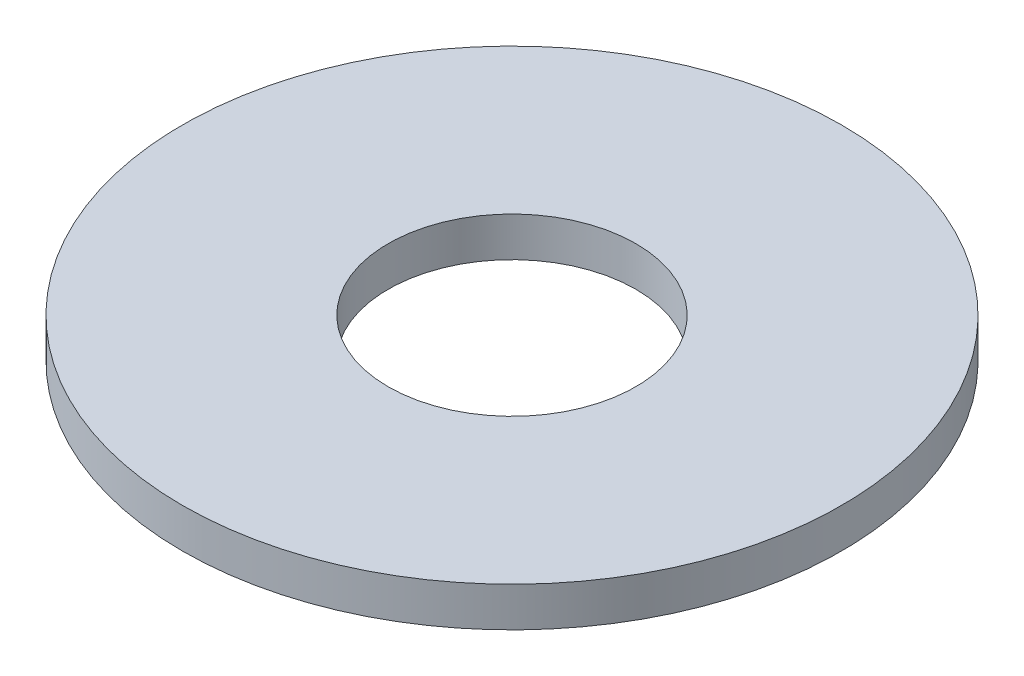
ISO-10303-21;
HEADER;
FILE_DESCRIPTION(('STEP AP214'),'2;1');
FILE_NAME('part.step','',(''),(''),'','','');
FILE_SCHEMA(('AUTOMOTIVE_DESIGN { 1 0 10303 214 1 1 1 1 }'));
ENDSEC;
DATA;
#1=APPLICATION_CONTEXT('core data for automotive mechanical design processes');
#2=APPLICATION_PROTOCOL_DEFINITION('international standard','automotive_design',2000,#1);
#3=PRODUCT_CONTEXT('',#1,'mechanical');
#4=PRODUCT('Part','Part','',(#3));
#5=PRODUCT_RELATED_PRODUCT_CATEGORY('part','',(#4));
#6=PRODUCT_DEFINITION_FORMATION('','',#4);
#7=PRODUCT_DEFINITION_CONTEXT('part definition',#1,'design');
#8=PRODUCT_DEFINITION('design','',#6,#7);
#9=PRODUCT_DEFINITION_SHAPE('','',#8);
#10=(LENGTH_UNIT() NAMED_UNIT(*) SI_UNIT(.MILLI.,.METRE.));
#11=(NAMED_UNIT(*) PLANE_ANGLE_UNIT() SI_UNIT($,.RADIAN.));
#12=(NAMED_UNIT(*) SI_UNIT($,.STERADIAN.) SOLID_ANGLE_UNIT());
#13=UNCERTAINTY_MEASURE_WITH_UNIT(LENGTH_MEASURE(1.E-05),#10,'distance_accuracy_value','');
#14=(GEOMETRIC_REPRESENTATION_CONTEXT(3) GLOBAL_UNCERTAINTY_ASSIGNED_CONTEXT((#13)) GLOBAL_UNIT_ASSIGNED_CONTEXT((#10,
#11,#12)) REPRESENTATION_CONTEXT('',''));
#15=CARTESIAN_POINT('',(0.,0.,0.));
#16=DIRECTION('',(0.,0.,1.));
#17=DIRECTION('',(1.,0.,0.));
#18=AXIS2_PLACEMENT_3D('',#15,#16,#17);
#19=CARTESIAN_POINT('',(0.,0.762,0.));
#20=DIRECTION('',(0.,1.,0.));
#21=DIRECTION('',(0.,0.,1.));
#22=AXIS2_PLACEMENT_3D('',#19,#20,#21);
#23=PLANE('',#22);
#24=CARTESIAN_POINT('',(0.,0.762,0.));
#25=DIRECTION('',(0.,-1.,0.));
#26=DIRECTION('',(0.,0.,-1.));
#27=AXIS2_PLACEMENT_3D('',#24,#25,#26);
#28=CIRCLE('',#27,2.3876);
#29=CARTESIAN_POINT('',(0.,0.762,-2.3876));
#30=VERTEX_POINT('',#29);
#31=EDGE_CURVE('E27',#30,#30,#28,.T.);
#32=ORIENTED_EDGE('',*,*,#31,.T.);
#33=EDGE_LOOP('',(#32));
#34=FACE_BOUND('',#33,.T.);
#35=CARTESIAN_POINT('',(0.,0.762,0.));
#36=DIRECTION('',(0.,-1.,0.));
#37=DIRECTION('',(0.,0.,-1.));
#38=AXIS2_PLACEMENT_3D('',#35,#36,#37);
#39=CIRCLE('',#38,6.35);
#40=CARTESIAN_POINT('',(0.,0.762,-6.35));
#41=VERTEX_POINT('',#40);
#42=EDGE_CURVE('E18',#41,#41,#39,.T.);
#43=ORIENTED_EDGE('',*,*,#42,.F.);
#44=EDGE_LOOP('',(#43));
#45=FACE_BOUND('',#44,.T.);
#46=ADVANCED_FACE('F15',(#34,#45),#23,.T.);
#47=CARTESIAN_POINT('',(0.,0.762,0.));
#48=DIRECTION('',(0.,-1.,0.));
#49=DIRECTION('',(0.,0.,-1.));
#50=AXIS2_PLACEMENT_3D('',#47,#48,#49);
#51=CYLINDRICAL_SURFACE('',#50,6.35);
#52=ORIENTED_EDGE('',*,*,#42,.T.);
#53=EDGE_LOOP('',(#52));
#54=FACE_BOUND('',#53,.T.);
#55=CARTESIAN_POINT('',(0.,0.,0.));
#56=DIRECTION('',(0.,-1.,0.));
#57=DIRECTION('',(0.,0.,-1.));
#58=AXIS2_PLACEMENT_3D('',#55,#56,#57);
#59=CIRCLE('',#58,6.35);
#60=CARTESIAN_POINT('',(0.,0.,-6.35));
#61=VERTEX_POINT('',#60);
#62=EDGE_CURVE('E22',#61,#61,#59,.F.);
#63=ORIENTED_EDGE('',*,*,#62,.T.);
#64=EDGE_LOOP('',(#63));
#65=FACE_BOUND('',#64,.T.);
#66=ADVANCED_FACE('F35',(#54,#65),#51,.T.);
#67=CARTESIAN_POINT('',(0.,0.762,0.));
#68=DIRECTION('',(0.,-1.,0.));
#69=DIRECTION('',(0.,0.,-1.));
#70=AXIS2_PLACEMENT_3D('',#67,#68,#69);
#71=CYLINDRICAL_SURFACE('',#70,2.3876);
#72=CARTESIAN_POINT('',(0.,0.,0.));
#73=DIRECTION('',(0.,-1.,0.));
#74=DIRECTION('',(0.,0.,-1.));
#75=AXIS2_PLACEMENT_3D('',#72,#73,#74);
#76=CIRCLE('',#75,2.3876);
#77=CARTESIAN_POINT('',(0.,0.,-2.3876));
#78=VERTEX_POINT('',#77);
#79=EDGE_CURVE('E10',#78,#78,#76,.T.);
#80=ORIENTED_EDGE('',*,*,#79,.T.);
#81=EDGE_LOOP('',(#80));
#82=FACE_BOUND('',#81,.T.);
#83=ORIENTED_EDGE('',*,*,#31,.F.);
#84=EDGE_LOOP('',(#83));
#85=FACE_BOUND('',#84,.T.);
#86=ADVANCED_FACE('F43',(#82,#85),#71,.F.);
#87=CARTESIAN_POINT('',(0.,0.,0.));
#88=DIRECTION('',(0.,1.,0.));
#89=DIRECTION('',(0.,0.,1.));
#90=AXIS2_PLACEMENT_3D('',#87,#88,#89);
#91=PLANE('',#90);
#92=ORIENTED_EDGE('',*,*,#79,.F.);
#93=EDGE_LOOP('',(#92));
#94=FACE_BOUND('',#93,.T.);
#95=ORIENTED_EDGE('',*,*,#62,.F.);
#96=EDGE_LOOP('',(#95));
#97=FACE_BOUND('',#96,.T.);
#98=ADVANCED_FACE('F44',(#94,#97),#91,.F.);
#99=CLOSED_SHELL('',(#46,#66,#86,#98));
#100=MANIFOLD_SOLID_BREP('B1',#99);
#101=ADVANCED_BREP_SHAPE_REPRESENTATION('',(#18,#100),#14);
#102=SHAPE_DEFINITION_REPRESENTATION(#9,#101);
ENDSEC;
END-ISO-10303-21;
